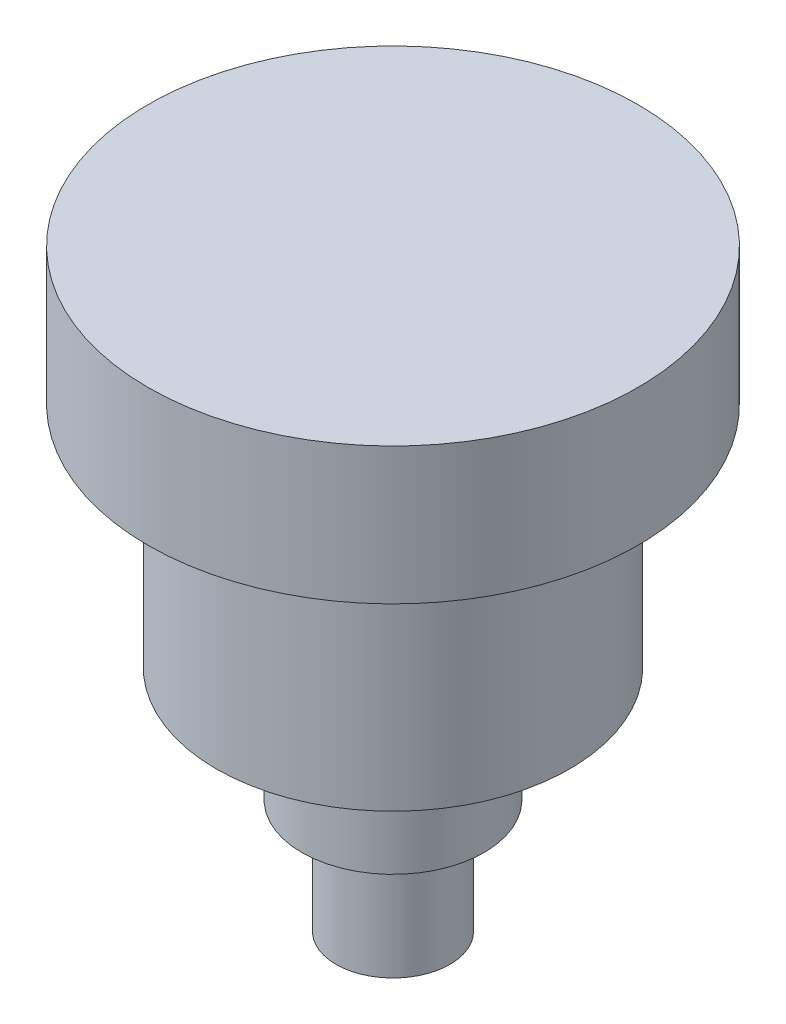
ISO-10303-21;
HEADER;
FILE_DESCRIPTION(('STEP AP214'),'2;1');
FILE_NAME('part.step','',(''),(''),'','','');
FILE_SCHEMA(('AUTOMOTIVE_DESIGN { 1 0 10303 214 1 1 1 1 }'));
ENDSEC;
DATA;
#1=APPLICATION_CONTEXT('core data for automotive mechanical design processes');
#2=APPLICATION_PROTOCOL_DEFINITION('international standard','automotive_design',2000,#1);
#3=PRODUCT_CONTEXT('',#1,'mechanical');
#4=PRODUCT('Part','Part','',(#3));
#5=PRODUCT_RELATED_PRODUCT_CATEGORY('part','',(#4));
#6=PRODUCT_DEFINITION_FORMATION('','',#4);
#7=PRODUCT_DEFINITION_CONTEXT('part definition',#1,'design');
#8=PRODUCT_DEFINITION('design','',#6,#7);
#9=PRODUCT_DEFINITION_SHAPE('','',#8);
#10=(LENGTH_UNIT() NAMED_UNIT(*) SI_UNIT(.MILLI.,.METRE.));
#11=(NAMED_UNIT(*) PLANE_ANGLE_UNIT() SI_UNIT($,.RADIAN.));
#12=(NAMED_UNIT(*) SI_UNIT($,.STERADIAN.) SOLID_ANGLE_UNIT());
#13=UNCERTAINTY_MEASURE_WITH_UNIT(LENGTH_MEASURE(1.E-05),#10,'distance_accuracy_value','');
#14=(GEOMETRIC_REPRESENTATION_CONTEXT(3) GLOBAL_UNCERTAINTY_ASSIGNED_CONTEXT((#13)) GLOBAL_UNIT_ASSIGNED_CONTEXT((#10,
#11,#12)) REPRESENTATION_CONTEXT('',''));
#15=CARTESIAN_POINT('',(0.,0.,0.));
#16=DIRECTION('',(0.,0.,1.));
#17=DIRECTION('',(1.,0.,0.));
#18=AXIS2_PLACEMENT_3D('',#15,#16,#17);
#19=CARTESIAN_POINT('',(0.,0.,0.));
#20=DIRECTION('',(0.,1.,0.));
#21=DIRECTION('',(0.,0.,1.));
#22=AXIS2_PLACEMENT_3D('',#19,#20,#21);
#23=PLANE('',#22);
#24=CARTESIAN_POINT('',(0.,0.,0.));
#25=DIRECTION('',(0.,1.,0.));
#26=DIRECTION('',(0.,0.,1.));
#27=AXIS2_PLACEMENT_3D('',#24,#25,#26);
#28=CIRCLE('',#27,2.5);
#29=CARTESIAN_POINT('',(0.,0.,2.5));
#30=VERTEX_POINT('',#29);
#31=EDGE_CURVE('E10',#30,#30,#28,.T.);
#32=ORIENTED_EDGE('',*,*,#31,.F.);
#33=EDGE_LOOP('',(#32));
#34=FACE_BOUND('',#33,.T.);
#35=ADVANCED_FACE('F35',(#34),#23,.F.);
#36=CARTESIAN_POINT('',(0.,35.1499999999999,0.));
#37=DIRECTION('',(0.,1.,0.));
#38=DIRECTION('',(0.,0.,1.));
#39=AXIS2_PLACEMENT_3D('',#36,#37,#38);
#40=CYLINDRICAL_SURFACE('',#39,2.5);
#41=CARTESIAN_POINT('',(0.,5.,0.));
#42=DIRECTION('',(0.,1.,0.));
#43=DIRECTION('',(0.,0.,1.));
#44=AXIS2_PLACEMENT_3D('',#41,#42,#43);
#45=CIRCLE('',#44,2.5);
#46=CARTESIAN_POINT('',(0.,5.,2.5));
#47=VERTEX_POINT('',#46);
#48=EDGE_CURVE('E41',#47,#47,#45,.T.);
#49=ORIENTED_EDGE('',*,*,#48,.F.);
#50=EDGE_LOOP('',(#49));
#51=FACE_BOUND('',#50,.T.);
#52=ORIENTED_EDGE('',*,*,#31,.T.);
#53=EDGE_LOOP('',(#52));
#54=FACE_BOUND('',#53,.T.);
#55=ADVANCED_FACE('F119',(#51,#54),#40,.T.);
#56=CARTESIAN_POINT('',(2.5,5.,0.));
#57=DIRECTION('',(0.,1.,0.));
#58=DIRECTION('',(0.,0.,1.));
#59=AXIS2_PLACEMENT_3D('',#56,#57,#58);
#60=PLANE('',#59);
#61=CARTESIAN_POINT('',(0.,5.,0.));
#62=DIRECTION('',(0.,1.,0.));
#63=DIRECTION('',(0.,0.,1.));
#64=AXIS2_PLACEMENT_3D('',#61,#62,#63);
#65=CIRCLE('',#64,4.);
#66=CARTESIAN_POINT('',(0.,5.,4.));
#67=VERTEX_POINT('',#66);
#68=EDGE_CURVE('E45',#67,#67,#65,.T.);
#69=ORIENTED_EDGE('',*,*,#68,.F.);
#70=EDGE_LOOP('',(#69));
#71=FACE_BOUND('',#70,.T.);
#72=ORIENTED_EDGE('',*,*,#48,.T.);
#73=EDGE_LOOP('',(#72));
#74=FACE_BOUND('',#73,.T.);
#75=ADVANCED_FACE('F114',(#71,#74),#60,.F.);
#76=CARTESIAN_POINT('',(0.,35.1499999999999,0.));
#77=DIRECTION('',(0.,1.,0.));
#78=DIRECTION('',(0.,0.,1.));
#79=AXIS2_PLACEMENT_3D('',#76,#77,#78);
#80=CYLINDRICAL_SURFACE('',#79,4.);
#81=CARTESIAN_POINT('',(0.,10.,0.));
#82=DIRECTION('',(0.,1.,0.));
#83=DIRECTION('',(0.,0.,1.));
#84=AXIS2_PLACEMENT_3D('',#81,#82,#83);
#85=CIRCLE('',#84,4.);
#86=CARTESIAN_POINT('',(0.,10.,4.));
#87=VERTEX_POINT('',#86);
#88=EDGE_CURVE('E49',#87,#87,#85,.T.);
#89=ORIENTED_EDGE('',*,*,#88,.F.);
#90=EDGE_LOOP('',(#89));
#91=FACE_BOUND('',#90,.T.);
#92=ORIENTED_EDGE('',*,*,#68,.T.);
#93=EDGE_LOOP('',(#92));
#94=FACE_BOUND('',#93,.T.);
#95=ADVANCED_FACE('F108',(#91,#94),#80,.T.);
#96=CARTESIAN_POINT('',(4.,10.,0.));
#97=DIRECTION('',(0.,1.,0.));
#98=DIRECTION('',(0.,0.,1.));
#99=AXIS2_PLACEMENT_3D('',#96,#97,#98);
#100=PLANE('',#99);
#101=CARTESIAN_POINT('',(0.,10.,0.));
#102=DIRECTION('',(0.,1.,0.));
#103=DIRECTION('',(0.,0.,1.));
#104=AXIS2_PLACEMENT_3D('',#101,#102,#103);
#105=CIRCLE('',#104,5.);
#106=CARTESIAN_POINT('',(0.,10.,5.));
#107=VERTEX_POINT('',#106);
#108=EDGE_CURVE('E54',#107,#107,#105,.T.);
#109=ORIENTED_EDGE('',*,*,#108,.F.);
#110=EDGE_LOOP('',(#109));
#111=FACE_BOUND('',#110,.T.);
#112=ORIENTED_EDGE('',*,*,#88,.T.);
#113=EDGE_LOOP('',(#112));
#114=FACE_BOUND('',#113,.T.);
#115=ADVANCED_FACE('F102',(#111,#114),#100,.F.);
#116=CARTESIAN_POINT('',(0.,35.1499999999999,0.));
#117=DIRECTION('',(0.,1.,0.));
#118=DIRECTION('',(0.,0.,1.));
#119=AXIS2_PLACEMENT_3D('',#116,#117,#118);
#120=CYLINDRICAL_SURFACE('',#119,5.);
#121=CARTESIAN_POINT('',(0.,10.05,0.));
#122=DIRECTION('',(0.,1.,0.));
#123=DIRECTION('',(0.,0.,1.));
#124=AXIS2_PLACEMENT_3D('',#121,#122,#123);
#125=CIRCLE('',#124,5.);
#126=CARTESIAN_POINT('',(0.,10.05,5.));
#127=VERTEX_POINT('',#126);
#128=EDGE_CURVE('E57',#127,#127,#125,.T.);
#129=ORIENTED_EDGE('',*,*,#128,.F.);
#130=EDGE_LOOP('',(#129));
#131=FACE_BOUND('',#130,.T.);
#132=ORIENTED_EDGE('',*,*,#108,.T.);
#133=EDGE_LOOP('',(#132));
#134=FACE_BOUND('',#133,.T.);
#135=ADVANCED_FACE('F96',(#131,#134),#120,.T.);
#136=CARTESIAN_POINT('',(5.,10.05,0.));
#137=DIRECTION('',(0.,1.,0.));
#138=DIRECTION('',(0.,0.,1.));
#139=AXIS2_PLACEMENT_3D('',#136,#137,#138);
#140=PLANE('',#139);
#141=CARTESIAN_POINT('',(0.,10.05,0.));
#142=DIRECTION('',(0.,1.,0.));
#143=DIRECTION('',(0.,0.,1.));
#144=AXIS2_PLACEMENT_3D('',#141,#142,#143);
#145=CIRCLE('',#144,7.75);
#146=CARTESIAN_POINT('',(0.,10.05,7.75));
#147=VERTEX_POINT('',#146);
#148=EDGE_CURVE('E60',#147,#147,#145,.T.);
#149=ORIENTED_EDGE('',*,*,#148,.F.);
#150=EDGE_LOOP('',(#149));
#151=FACE_BOUND('',#150,.T.);
#152=ORIENTED_EDGE('',*,*,#128,.T.);
#153=EDGE_LOOP('',(#152));
#154=FACE_BOUND('',#153,.T.);
#155=ADVANCED_FACE('F90',(#151,#154),#140,.F.);
#156=CARTESIAN_POINT('',(0.,35.1499999999999,0.));
#157=DIRECTION('',(0.,1.,0.));
#158=DIRECTION('',(0.,0.,1.));
#159=AXIS2_PLACEMENT_3D('',#156,#157,#158);
#160=CYLINDRICAL_SURFACE('',#159,7.75);
#161=CARTESIAN_POINT('',(0.,20.05,0.));
#162=DIRECTION('',(0.,1.,0.));
#163=DIRECTION('',(0.,0.,1.));
#164=AXIS2_PLACEMENT_3D('',#161,#162,#163);
#165=CIRCLE('',#164,7.75);
#166=CARTESIAN_POINT('',(0.,20.05,7.75));
#167=VERTEX_POINT('',#166);
#168=EDGE_CURVE('E63',#167,#167,#165,.T.);
#169=ORIENTED_EDGE('',*,*,#168,.F.);
#170=EDGE_LOOP('',(#169));
#171=FACE_BOUND('',#170,.T.);
#172=ORIENTED_EDGE('',*,*,#148,.T.);
#173=EDGE_LOOP('',(#172));
#174=FACE_BOUND('',#173,.T.);
#175=ADVANCED_FACE('F84',(#171,#174),#160,.T.);
#176=CARTESIAN_POINT('',(7.75,20.05,0.));
#177=DIRECTION('',(0.,1.,0.));
#178=DIRECTION('',(0.,0.,1.));
#179=AXIS2_PLACEMENT_3D('',#176,#177,#178);
#180=PLANE('',#179);
#181=CARTESIAN_POINT('',(0.,20.05,0.));
#182=DIRECTION('',(0.,1.,0.));
#183=DIRECTION('',(0.,0.,1.));
#184=AXIS2_PLACEMENT_3D('',#181,#182,#183);
#185=CIRCLE('',#184,10.75);
#186=CARTESIAN_POINT('',(0.,20.05,10.75));
#187=VERTEX_POINT('',#186);
#188=EDGE_CURVE('E66',#187,#187,#185,.T.);
#189=ORIENTED_EDGE('',*,*,#188,.F.);
#190=EDGE_LOOP('',(#189));
#191=FACE_BOUND('',#190,.T.);
#192=ORIENTED_EDGE('',*,*,#168,.T.);
#193=EDGE_LOOP('',(#192));
#194=FACE_BOUND('',#193,.T.);
#195=ADVANCED_FACE('F78',(#191,#194),#180,.F.);
#196=CARTESIAN_POINT('',(0.,35.1499999999999,0.));
#197=DIRECTION('',(0.,1.,0.));
#198=DIRECTION('',(0.,0.,1.));
#199=AXIS2_PLACEMENT_3D('',#196,#197,#198);
#200=CYLINDRICAL_SURFACE('',#199,10.75);
#201=CARTESIAN_POINT('',(0.,26.05,0.));
#202=DIRECTION('',(0.,1.,0.));
#203=DIRECTION('',(0.,0.,1.));
#204=AXIS2_PLACEMENT_3D('',#201,#202,#203);
#205=CIRCLE('',#204,10.75);
#206=CARTESIAN_POINT('',(0.,26.05,10.75));
#207=VERTEX_POINT('',#206);
#208=EDGE_CURVE('E69',#207,#207,#205,.T.);
#209=ORIENTED_EDGE('',*,*,#208,.F.);
#210=EDGE_LOOP('',(#209));
#211=FACE_BOUND('',#210,.T.);
#212=ORIENTED_EDGE('',*,*,#188,.T.);
#213=EDGE_LOOP('',(#212));
#214=FACE_BOUND('',#213,.T.);
#215=ADVANCED_FACE('F75',(#211,#214),#200,.T.);
#216=CARTESIAN_POINT('',(10.75,26.05,0.));
#217=DIRECTION('',(0.,-1.,0.));
#218=DIRECTION('',(0.,0.,-1.));
#219=AXIS2_PLACEMENT_3D('',#216,#217,#218);
#220=PLANE('',#219);
#221=ORIENTED_EDGE('',*,*,#208,.T.);
#222=EDGE_LOOP('',(#221));
#223=FACE_BOUND('',#222,.T.);
#224=ADVANCED_FACE('F73',(#223),#220,.F.);
#225=CLOSED_SHELL('',(#35,#55,#75,#95,#115,#135,#155,#175,#195,#215,#224));
#226=MANIFOLD_SOLID_BREP('B2',#225);
#227=ADVANCED_BREP_SHAPE_REPRESENTATION('',(#18,#226),#14);
#228=SHAPE_DEFINITION_REPRESENTATION(#9,#227);
ENDSEC;
END-ISO-10303-21;
